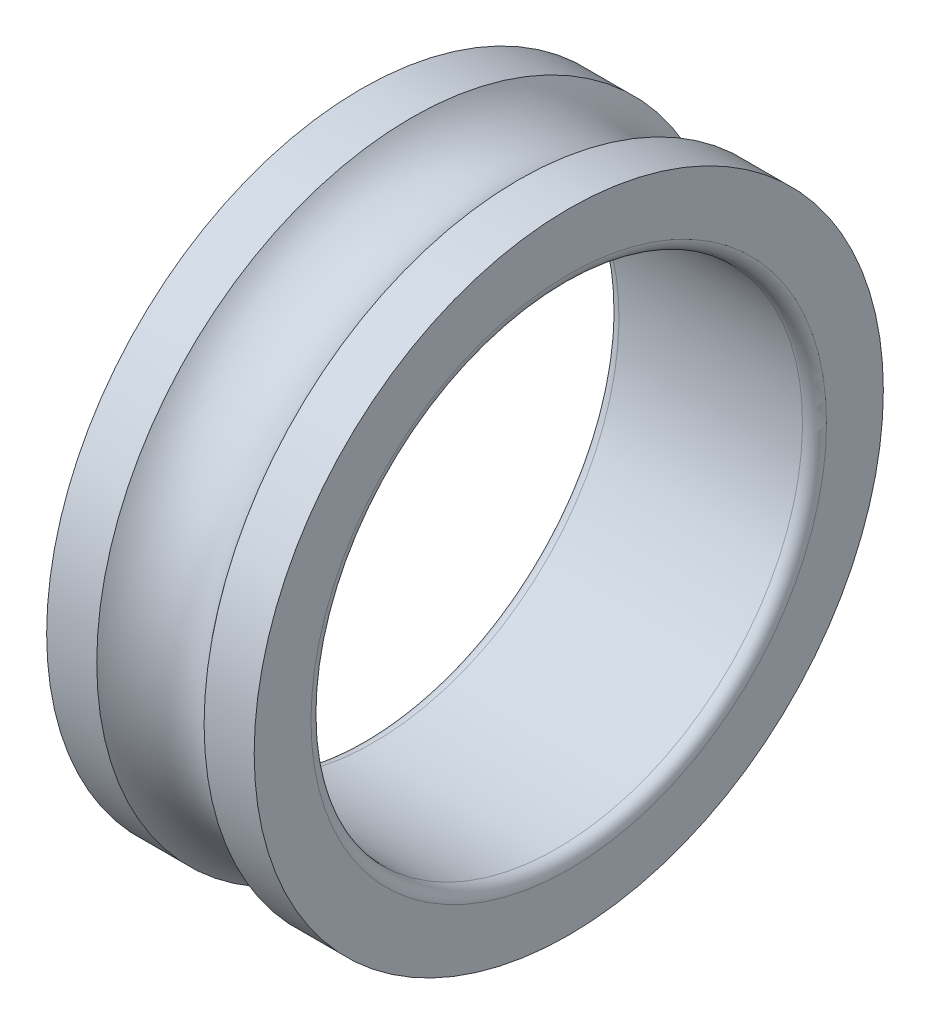
ISO-10303-21;
HEADER;
FILE_DESCRIPTION(('STEP AP214'),'2;1');
FILE_NAME('part.step','',(''),(''),'','','');
FILE_SCHEMA(('AUTOMOTIVE_DESIGN { 1 0 10303 214 1 1 1 1 }'));
ENDSEC;
DATA;
#1=APPLICATION_CONTEXT('core data for automotive mechanical design processes');
#2=APPLICATION_PROTOCOL_DEFINITION('international standard','automotive_design',2000,#1);
#3=PRODUCT_CONTEXT('',#1,'mechanical');
#4=PRODUCT('Part','Part','',(#3));
#5=PRODUCT_RELATED_PRODUCT_CATEGORY('part','',(#4));
#6=PRODUCT_DEFINITION_FORMATION('','',#4);
#7=PRODUCT_DEFINITION_CONTEXT('part definition',#1,'design');
#8=PRODUCT_DEFINITION('design','',#6,#7);
#9=PRODUCT_DEFINITION_SHAPE('','',#8);
#10=(LENGTH_UNIT() NAMED_UNIT(*) SI_UNIT(.MILLI.,.METRE.));
#11=(NAMED_UNIT(*) PLANE_ANGLE_UNIT() SI_UNIT($,.RADIAN.));
#12=(NAMED_UNIT(*) SI_UNIT($,.STERADIAN.) SOLID_ANGLE_UNIT());
#13=UNCERTAINTY_MEASURE_WITH_UNIT(LENGTH_MEASURE(1.E-05),#10,'distance_accuracy_value','');
#14=(GEOMETRIC_REPRESENTATION_CONTEXT(3) GLOBAL_UNCERTAINTY_ASSIGNED_CONTEXT((#13)) GLOBAL_UNIT_ASSIGNED_CONTEXT((#10,
#11,#12)) REPRESENTATION_CONTEXT('',''));
#15=CARTESIAN_POINT('',(0.,0.,0.));
#16=DIRECTION('',(0.,0.,1.));
#17=DIRECTION('',(1.,0.,0.));
#18=AXIS2_PLACEMENT_3D('',#15,#16,#17);
#19=CARTESIAN_POINT('',(16.7071809177389,0.,0.));
#20=DIRECTION('',(-1.,0.,0.));
#21=DIRECTION('',(0.,1.,0.));
#22=AXIS2_PLACEMENT_3D('',#19,#20,#21);
#23=CYLINDRICAL_SURFACE('',#22,28.8);
#24=CARTESIAN_POINT('',(14.4143618354777,0.,0.));
#25=DIRECTION('',(1.,0.,0.));
#26=DIRECTION('',(0.,1.,0.));
#27=AXIS2_PLACEMENT_3D('',#24,#25,#26);
#28=CIRCLE('',#27,28.8);
#29=CARTESIAN_POINT('',(14.4143618354777,28.8,0.));
#30=VERTEX_POINT('',#29);
#31=EDGE_CURVE('E11',#30,#30,#28,.T.);
#32=ORIENTED_EDGE('',*,*,#31,.T.);
#33=EDGE_LOOP('',(#32));
#34=FACE_BOUND('',#33,.T.);
#35=CARTESIAN_POINT('',(19.,0.,0.));
#36=DIRECTION('',(1.,0.,0.));
#37=DIRECTION('',(0.,1.,0.));
#38=AXIS2_PLACEMENT_3D('',#35,#36,#37);
#39=CIRCLE('',#38,28.8);
#40=CARTESIAN_POINT('',(19.,28.8,0.));
#41=VERTEX_POINT('',#40);
#42=EDGE_CURVE('E58',#41,#41,#39,.T.);
#43=ORIENTED_EDGE('',*,*,#42,.F.);
#44=EDGE_LOOP('',(#43));
#45=FACE_BOUND('',#44,.T.);
#46=ADVANCED_FACE('F17',(#34,#45),#23,.T.);
#47=CARTESIAN_POINT('',(9.5,0.,0.));
#48=DIRECTION('',(1.,0.,0.));
#49=DIRECTION('',(0.,0.,-1.));
#50=AXIS2_PLACEMENT_3D('',#47,#48,#49);
#51=TOROIDAL_SURFACE('',#50,32.5,6.1515);
#52=CARTESIAN_POINT('',(4.58563816452227,0.,0.));
#53=DIRECTION('',(1.,0.,0.));
#54=DIRECTION('',(0.,1.,0.));
#55=AXIS2_PLACEMENT_3D('',#52,#53,#54);
#56=CIRCLE('',#55,28.8);
#57=CARTESIAN_POINT('',(4.58563816452227,28.8,0.));
#58=VERTEX_POINT('',#57);
#59=EDGE_CURVE('E26',#58,#58,#56,.T.);
#60=ORIENTED_EDGE('',*,*,#59,.T.);
#61=EDGE_LOOP('',(#60));
#62=FACE_BOUND('',#61,.T.);
#63=ORIENTED_EDGE('',*,*,#31,.F.);
#64=EDGE_LOOP('',(#63));
#65=FACE_BOUND('',#64,.T.);
#66=ADVANCED_FACE('F83',(#62,#65),#51,.F.);
#67=CARTESIAN_POINT('',(2.29281908226113,0.,0.));
#68=DIRECTION('',(-1.,0.,0.));
#69=DIRECTION('',(0.,1.,0.));
#70=AXIS2_PLACEMENT_3D('',#67,#68,#69);
#71=CYLINDRICAL_SURFACE('',#70,28.8);
#72=CARTESIAN_POINT('',(0.,0.,0.));
#73=DIRECTION('',(1.,0.,0.));
#74=DIRECTION('',(0.,1.,0.));
#75=AXIS2_PLACEMENT_3D('',#72,#73,#74);
#76=CIRCLE('',#75,28.8);
#77=CARTESIAN_POINT('',(0.,28.8,0.));
#78=VERTEX_POINT('',#77);
#79=EDGE_CURVE('E21',#78,#78,#76,.T.);
#80=ORIENTED_EDGE('',*,*,#79,.T.);
#81=EDGE_LOOP('',(#80));
#82=FACE_BOUND('',#81,.T.);
#83=ORIENTED_EDGE('',*,*,#59,.F.);
#84=EDGE_LOOP('',(#83));
#85=FACE_BOUND('',#84,.T.);
#86=ADVANCED_FACE('F88',(#82,#85),#71,.T.);
#87=CARTESIAN_POINT('',(0.,26.2,0.));
#88=DIRECTION('',(-1.,0.,0.));
#89=DIRECTION('',(0.,-1.,0.));
#90=AXIS2_PLACEMENT_3D('',#87,#88,#89);
#91=PLANE('',#90);
#92=CARTESIAN_POINT('',(0.,0.,0.));
#93=DIRECTION('',(1.,0.,0.));
#94=DIRECTION('',(0.,1.,0.));
#95=AXIS2_PLACEMENT_3D('',#92,#93,#94);
#96=CIRCLE('',#95,23.6);
#97=CARTESIAN_POINT('',(0.,23.6,0.));
#98=VERTEX_POINT('',#97);
#99=EDGE_CURVE('E63',#98,#98,#96,.T.);
#100=ORIENTED_EDGE('',*,*,#99,.T.);
#101=EDGE_LOOP('',(#100));
#102=FACE_BOUND('',#101,.T.);
#103=ORIENTED_EDGE('',*,*,#79,.F.);
#104=EDGE_LOOP('',(#103));
#105=FACE_BOUND('',#104,.T.);
#106=ADVANCED_FACE('F80',(#102,#105),#91,.T.);
#107=CARTESIAN_POINT('',(1.1,0.,0.));
#108=DIRECTION('',(1.,0.,0.));
#109=DIRECTION('',(0.,0.,-1.));
#110=AXIS2_PLACEMENT_3D('',#107,#108,#109);
#111=TOROIDAL_SURFACE('',#110,23.6,1.1);
#112=CARTESIAN_POINT('',(1.1,0.,0.));
#113=DIRECTION('',(1.,0.,0.));
#114=DIRECTION('',(0.,1.,0.));
#115=AXIS2_PLACEMENT_3D('',#112,#113,#114);
#116=CIRCLE('',#115,22.5);
#117=CARTESIAN_POINT('',(1.1,22.5,0.));
#118=VERTEX_POINT('',#117);
#119=EDGE_CURVE('E65',#118,#118,#116,.T.);
#120=ORIENTED_EDGE('',*,*,#119,.T.);
#121=EDGE_LOOP('',(#120));
#122=FACE_BOUND('',#121,.T.);
#123=ORIENTED_EDGE('',*,*,#99,.F.);
#124=EDGE_LOOP('',(#123));
#125=FACE_BOUND('',#124,.T.);
#126=ADVANCED_FACE('F69',(#122,#125),#111,.T.);
#127=CARTESIAN_POINT('',(9.5,0.,0.));
#128=DIRECTION('',(-1.,0.,0.));
#129=DIRECTION('',(0.,1.,0.));
#130=AXIS2_PLACEMENT_3D('',#127,#128,#129);
#131=CYLINDRICAL_SURFACE('',#130,22.5);
#132=CARTESIAN_POINT('',(17.9,0.,0.));
#133=DIRECTION('',(1.,0.,0.));
#134=DIRECTION('',(0.,1.,0.));
#135=AXIS2_PLACEMENT_3D('',#132,#133,#134);
#136=CIRCLE('',#135,22.5);
#137=CARTESIAN_POINT('',(17.9,22.5,0.));
#138=VERTEX_POINT('',#137);
#139=EDGE_CURVE('E59',#138,#138,#136,.T.);
#140=ORIENTED_EDGE('',*,*,#139,.T.);
#141=EDGE_LOOP('',(#140));
#142=FACE_BOUND('',#141,.T.);
#143=ORIENTED_EDGE('',*,*,#119,.F.);
#144=EDGE_LOOP('',(#143));
#145=FACE_BOUND('',#144,.T.);
#146=ADVANCED_FACE('F19',(#142,#145),#131,.F.);
#147=CARTESIAN_POINT('',(17.9,0.,0.));
#148=DIRECTION('',(1.,0.,0.));
#149=DIRECTION('',(0.,0.,-1.));
#150=AXIS2_PLACEMENT_3D('',#147,#148,#149);
#151=TOROIDAL_SURFACE('',#150,23.6,1.1);
#152=CARTESIAN_POINT('',(19.,0.,0.));
#153=DIRECTION('',(1.,0.,0.));
#154=DIRECTION('',(0.,1.,0.));
#155=AXIS2_PLACEMENT_3D('',#152,#153,#154);
#156=CIRCLE('',#155,23.6);
#157=CARTESIAN_POINT('',(19.,23.6,0.));
#158=VERTEX_POINT('',#157);
#159=EDGE_CURVE('E54',#158,#158,#156,.T.);
#160=ORIENTED_EDGE('',*,*,#159,.T.);
#161=EDGE_LOOP('',(#160));
#162=FACE_BOUND('',#161,.T.);
#163=ORIENTED_EDGE('',*,*,#139,.F.);
#164=EDGE_LOOP('',(#163));
#165=FACE_BOUND('',#164,.T.);
#166=ADVANCED_FACE('F55',(#162,#165),#151,.T.);
#167=CARTESIAN_POINT('',(19.,26.2,0.));
#168=DIRECTION('',(1.,0.,0.));
#169=DIRECTION('',(0.,1.,0.));
#170=AXIS2_PLACEMENT_3D('',#167,#168,#169);
#171=PLANE('',#170);
#172=ORIENTED_EDGE('',*,*,#42,.T.);
#173=EDGE_LOOP('',(#172));
#174=FACE_BOUND('',#173,.T.);
#175=ORIENTED_EDGE('',*,*,#159,.F.);
#176=EDGE_LOOP('',(#175));
#177=FACE_BOUND('',#176,.T.);
#178=ADVANCED_FACE('F79',(#174,#177),#171,.T.);
#179=CLOSED_SHELL('',(#46,#66,#86,#106,#126,#146,#166,#178));
#180=MANIFOLD_SOLID_BREP('B1',#179);
#181=ADVANCED_BREP_SHAPE_REPRESENTATION('',(#18,#180),#14);
#182=SHAPE_DEFINITION_REPRESENTATION(#9,#181);
ENDSEC;
END-ISO-10303-21;
